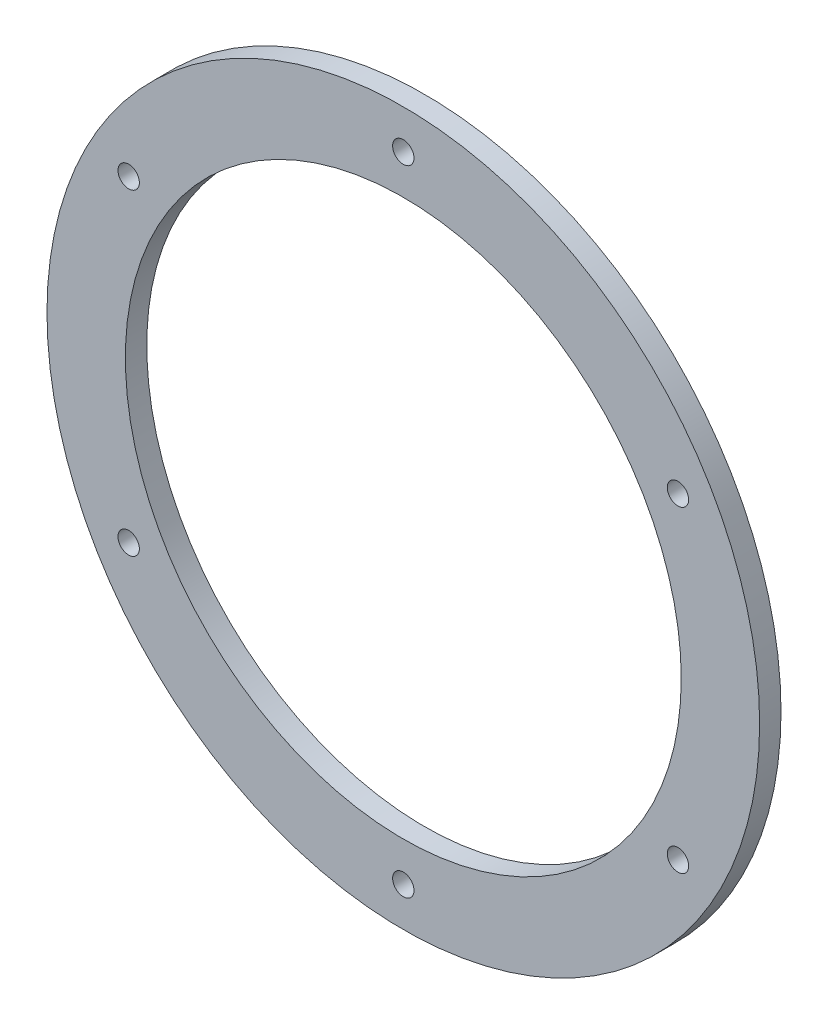
ISO-10303-21;
HEADER;
FILE_DESCRIPTION(('STEP AP214'),'2;1');
FILE_NAME('part.step','',(''),(''),'','','');
FILE_SCHEMA(('AUTOMOTIVE_DESIGN { 1 0 10303 214 1 1 1 1 }'));
ENDSEC;
DATA;
#1=APPLICATION_CONTEXT('core data for automotive mechanical design processes');
#2=APPLICATION_PROTOCOL_DEFINITION('international standard','automotive_design',2000,#1);
#3=PRODUCT_CONTEXT('',#1,'mechanical');
#4=PRODUCT('Part','Part','',(#3));
#5=PRODUCT_RELATED_PRODUCT_CATEGORY('part','',(#4));
#6=PRODUCT_DEFINITION_FORMATION('','',#4);
#7=PRODUCT_DEFINITION_CONTEXT('part definition',#1,'design');
#8=PRODUCT_DEFINITION('design','',#6,#7);
#9=PRODUCT_DEFINITION_SHAPE('','',#8);
#10=(LENGTH_UNIT() NAMED_UNIT(*) SI_UNIT(.MILLI.,.METRE.));
#11=(NAMED_UNIT(*) PLANE_ANGLE_UNIT() SI_UNIT($,.RADIAN.));
#12=(NAMED_UNIT(*) SI_UNIT($,.STERADIAN.) SOLID_ANGLE_UNIT());
#13=UNCERTAINTY_MEASURE_WITH_UNIT(LENGTH_MEASURE(1.E-05),#10,'distance_accuracy_value','');
#14=(GEOMETRIC_REPRESENTATION_CONTEXT(3) GLOBAL_UNCERTAINTY_ASSIGNED_CONTEXT((#13)) GLOBAL_UNIT_ASSIGNED_CONTEXT((#10,
#11,#12)) REPRESENTATION_CONTEXT('',''));
#15=CARTESIAN_POINT('',(0.,0.,0.));
#16=DIRECTION('',(0.,0.,1.));
#17=DIRECTION('',(1.,0.,0.));
#18=AXIS2_PLACEMENT_3D('',#15,#16,#17);
#19=CARTESIAN_POINT('',(0.,0.,3.));
#20=DIRECTION('',(0.,0.,1.));
#21=DIRECTION('',(1.,0.,0.));
#22=AXIS2_PLACEMENT_3D('',#19,#20,#21);
#23=PLANE('',#22);
#24=CARTESIAN_POINT('',(0.,44.5,3.));
#25=DIRECTION('',(0.,0.,1.));
#26=DIRECTION('',(1.,0.,0.));
#27=AXIS2_PLACEMENT_3D('',#24,#25,#26);
#28=CIRCLE('',#27,1.5);
#29=CARTESIAN_POINT('',(1.5,44.5,3.));
#30=VERTEX_POINT('',#29);
#31=EDGE_CURVE('E83',#30,#30,#28,.T.);
#32=ORIENTED_EDGE('',*,*,#31,.F.);
#33=EDGE_LOOP('',(#32));
#34=FACE_BOUND('',#33,.T.);
#35=CARTESIAN_POINT('',(-38.5381304684075,22.25,3.));
#36=DIRECTION('',(0.,0.,1.));
#37=DIRECTION('',(1.,0.,0.));
#38=AXIS2_PLACEMENT_3D('',#35,#36,#37);
#39=CIRCLE('',#38,1.5);
#40=CARTESIAN_POINT('',(-37.0381304684075,22.25,3.));
#41=VERTEX_POINT('',#40);
#42=EDGE_CURVE('E62',#41,#41,#39,.T.);
#43=ORIENTED_EDGE('',*,*,#42,.F.);
#44=EDGE_LOOP('',(#43));
#45=FACE_BOUND('',#44,.T.);
#46=CARTESIAN_POINT('',(-38.5381304684075,-22.25,3.));
#47=DIRECTION('',(0.,0.,1.));
#48=DIRECTION('',(1.,0.,0.));
#49=AXIS2_PLACEMENT_3D('',#46,#47,#48);
#50=CIRCLE('',#49,1.5);
#51=CARTESIAN_POINT('',(-37.0381304684075,-22.25,3.));
#52=VERTEX_POINT('',#51);
#53=EDGE_CURVE('E61',#52,#52,#50,.T.);
#54=ORIENTED_EDGE('',*,*,#53,.F.);
#55=EDGE_LOOP('',(#54));
#56=FACE_BOUND('',#55,.T.);
#57=CARTESIAN_POINT('',(0.,-44.5,3.));
#58=DIRECTION('',(0.,0.,1.));
#59=DIRECTION('',(1.,0.,0.));
#60=AXIS2_PLACEMENT_3D('',#57,#58,#59);
#61=CIRCLE('',#60,1.5);
#62=CARTESIAN_POINT('',(1.50000000000001,-44.5,3.));
#63=VERTEX_POINT('',#62);
#64=EDGE_CURVE('E68',#63,#63,#61,.T.);
#65=ORIENTED_EDGE('',*,*,#64,.F.);
#66=EDGE_LOOP('',(#65));
#67=FACE_BOUND('',#66,.T.);
#68=CARTESIAN_POINT('',(38.5381304684075,-22.25,3.));
#69=DIRECTION('',(0.,0.,1.));
#70=DIRECTION('',(1.,0.,0.));
#71=AXIS2_PLACEMENT_3D('',#68,#69,#70);
#72=CIRCLE('',#71,1.5);
#73=CARTESIAN_POINT('',(40.0381304684075,-22.25,3.));
#74=VERTEX_POINT('',#73);
#75=EDGE_CURVE('E74',#74,#74,#72,.T.);
#76=ORIENTED_EDGE('',*,*,#75,.F.);
#77=EDGE_LOOP('',(#76));
#78=FACE_BOUND('',#77,.T.);
#79=CARTESIAN_POINT('',(38.5381304684075,22.25,3.));
#80=DIRECTION('',(0.,0.,1.));
#81=DIRECTION('',(1.,0.,0.));
#82=AXIS2_PLACEMENT_3D('',#79,#80,#81);
#83=CIRCLE('',#82,1.50000000000001);
#84=CARTESIAN_POINT('',(40.0381304684075,22.25,3.));
#85=VERTEX_POINT('',#84);
#86=EDGE_CURVE('E80',#85,#85,#83,.T.);
#87=ORIENTED_EDGE('',*,*,#86,.F.);
#88=EDGE_LOOP('',(#87));
#89=FACE_BOUND('',#88,.T.);
#90=CARTESIAN_POINT('',(0.,0.,3.));
#91=DIRECTION('',(0.,0.,1.));
#92=DIRECTION('',(1.,0.,0.));
#93=AXIS2_PLACEMENT_3D('',#90,#91,#92);
#94=CIRCLE('',#93,50.);
#95=CARTESIAN_POINT('',(50.,0.,3.));
#96=VERTEX_POINT('',#95);
#97=EDGE_CURVE('E10',#96,#96,#94,.T.);
#98=ORIENTED_EDGE('',*,*,#97,.T.);
#99=EDGE_LOOP('',(#98));
#100=FACE_BOUND('',#99,.T.);
#101=CARTESIAN_POINT('',(0.,0.,3.));
#102=DIRECTION('',(0.,0.,1.));
#103=DIRECTION('',(1.,0.,0.));
#104=AXIS2_PLACEMENT_3D('',#101,#102,#103);
#105=CIRCLE('',#104,39.);
#106=CARTESIAN_POINT('',(39.,0.,3.));
#107=VERTEX_POINT('',#106);
#108=EDGE_CURVE('E50',#107,#107,#105,.T.);
#109=ORIENTED_EDGE('',*,*,#108,.F.);
#110=EDGE_LOOP('',(#109));
#111=FACE_BOUND('',#110,.T.);
#112=ADVANCED_FACE('F39',(#34,#45,#56,#67,#78,#89,#100,#111),#23,.T.);
#113=CARTESIAN_POINT('',(0.,0.,0.));
#114=DIRECTION('',(0.,0.,1.));
#115=DIRECTION('',(1.,0.,0.));
#116=AXIS2_PLACEMENT_3D('',#113,#114,#115);
#117=PLANE('',#116);
#118=CARTESIAN_POINT('',(0.,44.5,0.));
#119=DIRECTION('',(0.,0.,1.));
#120=DIRECTION('',(1.,0.,0.));
#121=AXIS2_PLACEMENT_3D('',#118,#119,#120);
#122=CIRCLE('',#121,1.5);
#123=CARTESIAN_POINT('',(1.5,44.5,0.));
#124=VERTEX_POINT('',#123);
#125=EDGE_CURVE('E55',#124,#124,#122,.T.);
#126=ORIENTED_EDGE('',*,*,#125,.T.);
#127=EDGE_LOOP('',(#126));
#128=FACE_BOUND('',#127,.T.);
#129=CARTESIAN_POINT('',(-38.5381304684075,22.25,0.));
#130=DIRECTION('',(0.,0.,1.));
#131=DIRECTION('',(1.,0.,0.));
#132=AXIS2_PLACEMENT_3D('',#129,#130,#131);
#133=CIRCLE('',#132,1.5);
#134=CARTESIAN_POINT('',(-37.0381304684075,22.25,0.));
#135=VERTEX_POINT('',#134);
#136=EDGE_CURVE('E84',#135,#135,#133,.T.);
#137=ORIENTED_EDGE('',*,*,#136,.T.);
#138=EDGE_LOOP('',(#137));
#139=FACE_BOUND('',#138,.T.);
#140=CARTESIAN_POINT('',(-38.5381304684075,-22.25,0.));
#141=DIRECTION('',(0.,0.,1.));
#142=DIRECTION('',(1.,0.,0.));
#143=AXIS2_PLACEMENT_3D('',#140,#141,#142);
#144=CIRCLE('',#143,1.5);
#145=CARTESIAN_POINT('',(-37.0381304684075,-22.25,0.));
#146=VERTEX_POINT('',#145);
#147=EDGE_CURVE('E58',#146,#146,#144,.T.);
#148=ORIENTED_EDGE('',*,*,#147,.T.);
#149=EDGE_LOOP('',(#148));
#150=FACE_BOUND('',#149,.T.);
#151=CARTESIAN_POINT('',(0.,-44.5,0.));
#152=DIRECTION('',(0.,0.,1.));
#153=DIRECTION('',(1.,0.,0.));
#154=AXIS2_PLACEMENT_3D('',#151,#152,#153);
#155=CIRCLE('',#154,1.5);
#156=CARTESIAN_POINT('',(1.50000000000001,-44.5,0.));
#157=VERTEX_POINT('',#156);
#158=EDGE_CURVE('E65',#157,#157,#155,.T.);
#159=ORIENTED_EDGE('',*,*,#158,.T.);
#160=EDGE_LOOP('',(#159));
#161=FACE_BOUND('',#160,.T.);
#162=CARTESIAN_POINT('',(38.5381304684075,-22.25,0.));
#163=DIRECTION('',(0.,0.,1.));
#164=DIRECTION('',(1.,0.,0.));
#165=AXIS2_PLACEMENT_3D('',#162,#163,#164);
#166=CIRCLE('',#165,1.5);
#167=CARTESIAN_POINT('',(40.0381304684075,-22.25,0.));
#168=VERTEX_POINT('',#167);
#169=EDGE_CURVE('E71',#168,#168,#166,.T.);
#170=ORIENTED_EDGE('',*,*,#169,.T.);
#171=EDGE_LOOP('',(#170));
#172=FACE_BOUND('',#171,.T.);
#173=CARTESIAN_POINT('',(38.5381304684075,22.25,0.));
#174=DIRECTION('',(0.,0.,1.));
#175=DIRECTION('',(1.,0.,0.));
#176=AXIS2_PLACEMENT_3D('',#173,#174,#175);
#177=CIRCLE('',#176,1.50000000000001);
#178=CARTESIAN_POINT('',(40.0381304684075,22.25,0.));
#179=VERTEX_POINT('',#178);
#180=EDGE_CURVE('E77',#179,#179,#177,.T.);
#181=ORIENTED_EDGE('',*,*,#180,.T.);
#182=EDGE_LOOP('',(#181));
#183=FACE_BOUND('',#182,.T.);
#184=CARTESIAN_POINT('',(0.,0.,0.));
#185=DIRECTION('',(0.,0.,1.));
#186=DIRECTION('',(1.,0.,0.));
#187=AXIS2_PLACEMENT_3D('',#184,#185,#186);
#188=CIRCLE('',#187,50.);
#189=CARTESIAN_POINT('',(50.,0.,0.));
#190=VERTEX_POINT('',#189);
#191=EDGE_CURVE('E43',#190,#190,#188,.T.);
#192=ORIENTED_EDGE('',*,*,#191,.F.);
#193=EDGE_LOOP('',(#192));
#194=FACE_BOUND('',#193,.T.);
#195=CARTESIAN_POINT('',(0.,0.,0.));
#196=DIRECTION('',(0.,0.,1.));
#197=DIRECTION('',(1.,0.,0.));
#198=AXIS2_PLACEMENT_3D('',#195,#196,#197);
#199=CIRCLE('',#198,39.);
#200=CARTESIAN_POINT('',(39.,0.,0.));
#201=VERTEX_POINT('',#200);
#202=EDGE_CURVE('E52',#201,#201,#199,.T.);
#203=ORIENTED_EDGE('',*,*,#202,.T.);
#204=EDGE_LOOP('',(#203));
#205=FACE_BOUND('',#204,.T.);
#206=ADVANCED_FACE('F94',(#128,#139,#150,#161,#172,#183,#194,#205),#117,.F.);
#207=CARTESIAN_POINT('',(0.,0.,3.));
#208=DIRECTION('',(0.,0.,-1.));
#209=DIRECTION('',(-1.,0.,0.));
#210=AXIS2_PLACEMENT_3D('',#207,#208,#209);
#211=CYLINDRICAL_SURFACE('',#210,50.);
#212=ORIENTED_EDGE('',*,*,#97,.F.);
#213=EDGE_LOOP('',(#212));
#214=FACE_BOUND('',#213,.T.);
#215=ORIENTED_EDGE('',*,*,#191,.T.);
#216=EDGE_LOOP('',(#215));
#217=FACE_BOUND('',#216,.T.);
#218=ADVANCED_FACE('F41',(#214,#217),#211,.T.);
#219=CARTESIAN_POINT('',(0.,0.,3.));
#220=DIRECTION('',(0.,0.,-1.));
#221=DIRECTION('',(-1.,0.,0.));
#222=AXIS2_PLACEMENT_3D('',#219,#220,#221);
#223=CYLINDRICAL_SURFACE('',#222,39.);
#224=ORIENTED_EDGE('',*,*,#108,.T.);
#225=EDGE_LOOP('',(#224));
#226=FACE_BOUND('',#225,.T.);
#227=ORIENTED_EDGE('',*,*,#202,.F.);
#228=EDGE_LOOP('',(#227));
#229=FACE_BOUND('',#228,.T.);
#230=ADVANCED_FACE('F119',(#226,#229),#223,.F.);
#231=CARTESIAN_POINT('',(38.5381304684075,22.25,0.));
#232=DIRECTION('',(0.,0.,1.));
#233=DIRECTION('',(1.,0.,0.));
#234=AXIS2_PLACEMENT_3D('',#231,#232,#233);
#235=CYLINDRICAL_SURFACE('',#234,1.50000000000001);
#236=ORIENTED_EDGE('',*,*,#180,.F.);
#237=EDGE_LOOP('',(#236));
#238=FACE_BOUND('',#237,.T.);
#239=ORIENTED_EDGE('',*,*,#86,.T.);
#240=EDGE_LOOP('',(#239));
#241=FACE_BOUND('',#240,.T.);
#242=ADVANCED_FACE('F122',(#238,#241),#235,.F.);
#243=CARTESIAN_POINT('',(38.5381304684075,-22.25,0.));
#244=DIRECTION('',(0.,0.,1.));
#245=DIRECTION('',(1.,0.,0.));
#246=AXIS2_PLACEMENT_3D('',#243,#244,#245);
#247=CYLINDRICAL_SURFACE('',#246,1.5);
#248=ORIENTED_EDGE('',*,*,#169,.F.);
#249=EDGE_LOOP('',(#248));
#250=FACE_BOUND('',#249,.T.);
#251=ORIENTED_EDGE('',*,*,#75,.T.);
#252=EDGE_LOOP('',(#251));
#253=FACE_BOUND('',#252,.T.);
#254=ADVANCED_FACE('F140',(#250,#253),#247,.F.);
#255=CARTESIAN_POINT('',(0.,-44.5,0.));
#256=DIRECTION('',(0.,0.,1.));
#257=DIRECTION('',(1.,0.,0.));
#258=AXIS2_PLACEMENT_3D('',#255,#256,#257);
#259=CYLINDRICAL_SURFACE('',#258,1.5);
#260=ORIENTED_EDGE('',*,*,#158,.F.);
#261=EDGE_LOOP('',(#260));
#262=FACE_BOUND('',#261,.T.);
#263=ORIENTED_EDGE('',*,*,#64,.T.);
#264=EDGE_LOOP('',(#263));
#265=FACE_BOUND('',#264,.T.);
#266=ADVANCED_FACE('F136',(#262,#265),#259,.F.);
#267=CARTESIAN_POINT('',(-38.5381304684075,-22.25,0.));
#268=DIRECTION('',(0.,0.,1.));
#269=DIRECTION('',(1.,0.,0.));
#270=AXIS2_PLACEMENT_3D('',#267,#268,#269);
#271=CYLINDRICAL_SURFACE('',#270,1.5);
#272=ORIENTED_EDGE('',*,*,#147,.F.);
#273=EDGE_LOOP('',(#272));
#274=FACE_BOUND('',#273,.T.);
#275=ORIENTED_EDGE('',*,*,#53,.T.);
#276=EDGE_LOOP('',(#275));
#277=FACE_BOUND('',#276,.T.);
#278=ADVANCED_FACE('F133',(#274,#277),#271,.F.);
#279=CARTESIAN_POINT('',(-38.5381304684075,22.25,0.));
#280=DIRECTION('',(0.,0.,1.));
#281=DIRECTION('',(1.,0.,0.));
#282=AXIS2_PLACEMENT_3D('',#279,#280,#281);
#283=CYLINDRICAL_SURFACE('',#282,1.5);
#284=ORIENTED_EDGE('',*,*,#136,.F.);
#285=EDGE_LOOP('',(#284));
#286=FACE_BOUND('',#285,.T.);
#287=ORIENTED_EDGE('',*,*,#42,.T.);
#288=EDGE_LOOP('',(#287));
#289=FACE_BOUND('',#288,.T.);
#290=ADVANCED_FACE('F100',(#286,#289),#283,.F.);
#291=CARTESIAN_POINT('',(0.,44.5,0.));
#292=DIRECTION('',(0.,0.,1.));
#293=DIRECTION('',(1.,0.,0.));
#294=AXIS2_PLACEMENT_3D('',#291,#292,#293);
#295=CYLINDRICAL_SURFACE('',#294,1.5);
#296=ORIENTED_EDGE('',*,*,#125,.F.);
#297=EDGE_LOOP('',(#296));
#298=FACE_BOUND('',#297,.T.);
#299=ORIENTED_EDGE('',*,*,#31,.T.);
#300=EDGE_LOOP('',(#299));
#301=FACE_BOUND('',#300,.T.);
#302=ADVANCED_FACE('F97',(#298,#301),#295,.F.);
#303=CLOSED_SHELL('',(#112,#206,#218,#230,#242,#254,#266,#278,#290,#302));
#304=MANIFOLD_SOLID_BREP('B2',#303);
#305=ADVANCED_BREP_SHAPE_REPRESENTATION('',(#18,#304),#14);
#306=SHAPE_DEFINITION_REPRESENTATION(#9,#305);
ENDSEC;
END-ISO-10303-21;
